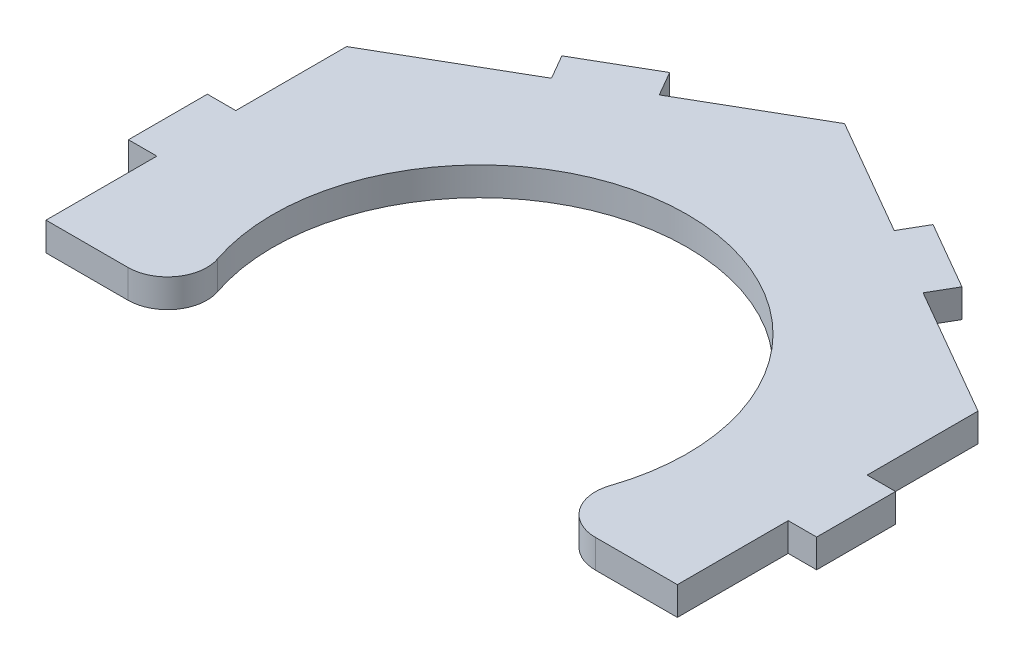
ISO-10303-21;
HEADER;
FILE_DESCRIPTION(('STEP AP214'),'2;1');
FILE_NAME('part.step','',(''),(''),'','','');
FILE_SCHEMA(('AUTOMOTIVE_DESIGN { 1 0 10303 214 1 1 1 1 }'));
ENDSEC;
DATA;
#1=APPLICATION_CONTEXT('core data for automotive mechanical design processes');
#2=APPLICATION_PROTOCOL_DEFINITION('international standard','automotive_design',2000,#1);
#3=PRODUCT_CONTEXT('',#1,'mechanical');
#4=PRODUCT('Part','Part','',(#3));
#5=PRODUCT_RELATED_PRODUCT_CATEGORY('part','',(#4));
#6=PRODUCT_DEFINITION_FORMATION('','',#4);
#7=PRODUCT_DEFINITION_CONTEXT('part definition',#1,'design');
#8=PRODUCT_DEFINITION('design','',#6,#7);
#9=PRODUCT_DEFINITION_SHAPE('','',#8);
#10=(LENGTH_UNIT() NAMED_UNIT(*) SI_UNIT(.MILLI.,.METRE.));
#11=(NAMED_UNIT(*) PLANE_ANGLE_UNIT() SI_UNIT($,.RADIAN.));
#12=(NAMED_UNIT(*) SI_UNIT($,.STERADIAN.) SOLID_ANGLE_UNIT());
#13=UNCERTAINTY_MEASURE_WITH_UNIT(LENGTH_MEASURE(1.E-05),#10,'distance_accuracy_value','');
#14=(GEOMETRIC_REPRESENTATION_CONTEXT(3) GLOBAL_UNCERTAINTY_ASSIGNED_CONTEXT((#13)) GLOBAL_UNIT_ASSIGNED_CONTEXT((#10,
#11,#12)) REPRESENTATION_CONTEXT('',''));
#15=CARTESIAN_POINT('',(0.,0.,0.));
#16=DIRECTION('',(0.,0.,1.));
#17=DIRECTION('',(1.,0.,0.));
#18=AXIS2_PLACEMENT_3D('',#15,#16,#17);
#19=CARTESIAN_POINT('',(50.8,4.572,19.05));
#20=DIRECTION('',(-1.,0.,0.));
#21=DIRECTION('',(0.,0.,1.));
#22=AXIS2_PLACEMENT_3D('',#19,#20,#21);
#23=PLANE('',#22);
#24=DIRECTION('',(0.,1.,0.));
#25=VECTOR('',#24,1.);
#26=CARTESIAN_POINT('',(50.8,0.,-11.4896968374165));
#27=LINE('',#26,#25);
#28=CARTESIAN_POINT('',(50.8,0.,-11.4896968374165));
#29=VERTEX_POINT('',#28);
#30=CARTESIAN_POINT('',(50.8,4.572,-11.4896968374165));
#31=VERTEX_POINT('',#30);
#32=EDGE_CURVE('E214',#29,#31,#27,.T.);
#33=ORIENTED_EDGE('',*,*,#32,.F.);
#34=DIRECTION('',(0.,0.,-1.));
#35=VECTOR('',#34,1.);
#36=CARTESIAN_POINT('',(50.8,0.,19.05));
#37=LINE('',#36,#35);
#38=CARTESIAN_POINT('',(50.8,0.,-29.329393674833));
#39=VERTEX_POINT('',#38);
#40=EDGE_CURVE('E281',#29,#39,#37,.T.);
#41=ORIENTED_EDGE('',*,*,#40,.T.);
#42=DIRECTION('',(0.,-1.,0.));
#43=VECTOR('',#42,1.);
#44=CARTESIAN_POINT('',(50.8,4.572,-29.329393674833));
#45=LINE('',#44,#43);
#46=CARTESIAN_POINT('',(50.8,4.572,-29.329393674833));
#47=VERTEX_POINT('',#46);
#48=EDGE_CURVE('E54',#47,#39,#45,.T.);
#49=ORIENTED_EDGE('',*,*,#48,.F.);
#50=DIRECTION('',(0.,0.,-1.));
#51=VECTOR('',#50,1.);
#52=CARTESIAN_POINT('',(50.8,4.572,19.05));
#53=LINE('',#52,#51);
#54=EDGE_CURVE('E231',#31,#47,#53,.T.);
#55=ORIENTED_EDGE('',*,*,#54,.F.);
#56=EDGE_LOOP('',(#33,#41,#49,#55));
#57=FACE_BOUND('',#56,.T.);
#58=ADVANCED_FACE('F45',(#57),#23,.F.);
#59=CARTESIAN_POINT('',(50.8,4.572,-29.329393674833));
#60=DIRECTION('',(-0.5,0.,0.866025403784439));
#61=DIRECTION('',(0.866025403784439,0.,0.5));
#62=AXIS2_PLACEMENT_3D('',#59,#60,#61);
#63=PLANE('',#62);
#64=DIRECTION('',(-0.866025403784439,0.,-0.5));
#65=VECTOR('',#64,1.);
#66=CARTESIAN_POINT('',(50.8,4.572,-29.329393674833));
#67=LINE('',#66,#65);
#68=CARTESIAN_POINT('',(18.9042843786191,4.572,-47.744393674833));
#69=VERTEX_POINT('',#68);
#70=CARTESIAN_POINT('',(0.,4.572,-58.658787349666));
#71=VERTEX_POINT('',#70);
#72=EDGE_CURVE('E69',#69,#71,#67,.T.);
#73=ORIENTED_EDGE('',*,*,#72,.F.);
#74=DIRECTION('',(0.,1.,0.));
#75=VECTOR('',#74,1.);
#76=CARTESIAN_POINT('',(18.9042843786191,0.,-47.744393674833));
#77=LINE('',#76,#75);
#78=CARTESIAN_POINT('',(18.9042843786191,0.,-47.744393674833));
#79=VERTEX_POINT('',#78);
#80=EDGE_CURVE('E472',#79,#69,#77,.T.);
#81=ORIENTED_EDGE('',*,*,#80,.F.);
#82=DIRECTION('',(-0.866025403784439,0.,-0.5));
#83=VECTOR('',#82,1.);
#84=CARTESIAN_POINT('',(50.8,0.,-29.329393674833));
#85=LINE('',#84,#83);
#86=CARTESIAN_POINT('',(0.,0.,-58.658787349666));
#87=VERTEX_POINT('',#86);
#88=EDGE_CURVE('E287',#79,#87,#85,.T.);
#89=ORIENTED_EDGE('',*,*,#88,.T.);
#90=DIRECTION('',(0.,-1.,0.));
#91=VECTOR('',#90,1.);
#92=CARTESIAN_POINT('',(0.,4.572,-58.658787349666));
#93=LINE('',#92,#91);
#94=EDGE_CURVE('E334',#71,#87,#93,.T.);
#95=ORIENTED_EDGE('',*,*,#94,.F.);
#96=EDGE_LOOP('',(#73,#81,#89,#95));
#97=FACE_BOUND('',#96,.T.);
#98=ADVANCED_FACE('F470',(#97),#63,.F.);
#99=CARTESIAN_POINT('',(0.,4.572,-58.658787349666));
#100=DIRECTION('',(0.5,0.,0.866025403784439));
#101=DIRECTION('',(0.866025403784439,0.,-0.5));
#102=AXIS2_PLACEMENT_3D('',#99,#100,#101);
#103=PLANE('',#102);
#104=DIRECTION('',(-0.866025403784439,0.,0.5));
#105=VECTOR('',#104,1.);
#106=CARTESIAN_POINT('',(0.,4.572,-58.658787349666));
#107=LINE('',#106,#105);
#108=CARTESIAN_POINT('',(-29.9028070066815,4.572,-41.394393674833));
#109=VERTEX_POINT('',#108);
#110=CARTESIAN_POINT('',(-50.8,4.572,-29.329393674833));
#111=VERTEX_POINT('',#110);
#112=EDGE_CURVE('E254',#109,#111,#107,.T.);
#113=ORIENTED_EDGE('',*,*,#112,.F.);
#114=DIRECTION('',(0.,1.,0.));
#115=VECTOR('',#114,1.);
#116=CARTESIAN_POINT('',(-29.9028070066815,0.,-41.394393674833));
#117=LINE('',#116,#115);
#118=CARTESIAN_POINT('',(-29.9028070066815,0.,-41.394393674833));
#119=VERTEX_POINT('',#118);
#120=EDGE_CURVE('E375',#119,#109,#117,.T.);
#121=ORIENTED_EDGE('',*,*,#120,.F.);
#122=DIRECTION('',(-0.866025403784439,0.,0.5));
#123=VECTOR('',#122,1.);
#124=CARTESIAN_POINT('',(0.,0.,-58.658787349666));
#125=LINE('',#124,#123);
#126=CARTESIAN_POINT('',(-50.8,0.,-29.329393674833));
#127=VERTEX_POINT('',#126);
#128=EDGE_CURVE('E291',#119,#127,#125,.T.);
#129=ORIENTED_EDGE('',*,*,#128,.T.);
#130=DIRECTION('',(0.,-1.,0.));
#131=VECTOR('',#130,1.);
#132=CARTESIAN_POINT('',(-50.8,4.572,-29.329393674833));
#133=LINE('',#132,#131);
#134=EDGE_CURVE('E330',#111,#127,#133,.T.);
#135=ORIENTED_EDGE('',*,*,#134,.F.);
#136=EDGE_LOOP('',(#113,#121,#129,#135));
#137=FACE_BOUND('',#136,.T.);
#138=ADVANCED_FACE('F447',(#137),#103,.F.);
#139=CARTESIAN_POINT('',(-50.8,4.572,-29.329393674833));
#140=DIRECTION('',(1.,0.,0.));
#141=DIRECTION('',(0.,0.,-1.));
#142=AXIS2_PLACEMENT_3D('',#139,#140,#141);
#143=PLANE('',#142);
#144=DIRECTION('',(0.,1.,0.));
#145=VECTOR('',#144,1.);
#146=CARTESIAN_POINT('',(-50.8,0.,1.21030316258351));
#147=LINE('',#146,#145);
#148=CARTESIAN_POINT('',(-50.8,0.,1.21030316258351));
#149=VERTEX_POINT('',#148);
#150=CARTESIAN_POINT('',(-50.8,4.572,1.21030316258351));
#151=VERTEX_POINT('',#150);
#152=EDGE_CURVE('E282',#149,#151,#147,.T.);
#153=ORIENTED_EDGE('',*,*,#152,.F.);
#154=DIRECTION('',(0.,0.,1.));
#155=VECTOR('',#154,1.);
#156=CARTESIAN_POINT('',(-50.8,0.,-29.329393674833));
#157=LINE('',#156,#155);
#158=CARTESIAN_POINT('',(-50.8,0.,19.05));
#159=VERTEX_POINT('',#158);
#160=EDGE_CURVE('E295',#149,#159,#157,.T.);
#161=ORIENTED_EDGE('',*,*,#160,.T.);
#162=DIRECTION('',(0.,-1.,0.));
#163=VECTOR('',#162,1.);
#164=CARTESIAN_POINT('',(-50.8,4.572,19.05));
#165=LINE('',#164,#163);
#166=CARTESIAN_POINT('',(-50.8,4.572,19.05));
#167=VERTEX_POINT('',#166);
#168=EDGE_CURVE('E326',#167,#159,#165,.T.);
#169=ORIENTED_EDGE('',*,*,#168,.F.);
#170=DIRECTION('',(0.,0.,1.));
#171=VECTOR('',#170,1.);
#172=CARTESIAN_POINT('',(-50.8,4.572,-29.329393674833));
#173=LINE('',#172,#171);
#174=EDGE_CURVE('E259',#151,#167,#173,.T.);
#175=ORIENTED_EDGE('',*,*,#174,.F.);
#176=EDGE_LOOP('',(#153,#161,#169,#175));
#177=FACE_BOUND('',#176,.T.);
#178=ADVANCED_FACE('F462',(#177),#143,.F.);
#179=CARTESIAN_POINT('',(50.8,4.572,19.05));
#180=DIRECTION('',(0.,0.,-1.));
#181=DIRECTION('',(-1.,0.,0.));
#182=AXIS2_PLACEMENT_3D('',#179,#180,#181);
#183=PLANE('',#182);
#184=DIRECTION('',(1.,0.,0.));
#185=VECTOR('',#184,1.);
#186=CARTESIAN_POINT('',(50.8,0.,19.05));
#187=LINE('',#186,#185);
#188=CARTESIAN_POINT('',(37.6006337213883,0.,19.05));
#189=VERTEX_POINT('',#188);
#190=CARTESIAN_POINT('',(50.8,0.,19.05));
#191=VERTEX_POINT('',#190);
#192=EDGE_CURVE('E277',#189,#191,#187,.T.);
#193=ORIENTED_EDGE('',*,*,#192,.T.);
#194=DIRECTION('',(0.,-1.,0.));
#195=VECTOR('',#194,1.);
#196=CARTESIAN_POINT('',(50.8,4.572,19.05));
#197=LINE('',#196,#195);
#198=CARTESIAN_POINT('',(50.8,4.572,19.05));
#199=VERTEX_POINT('',#198);
#200=EDGE_CURVE('E11',#199,#191,#197,.T.);
#201=ORIENTED_EDGE('',*,*,#200,.F.);
#202=DIRECTION('',(1.,0.,0.));
#203=VECTOR('',#202,1.);
#204=CARTESIAN_POINT('',(50.8,4.572,19.05));
#205=LINE('',#204,#203);
#206=CARTESIAN_POINT('',(37.6006337213883,4.572,19.05));
#207=VERTEX_POINT('',#206);
#208=EDGE_CURVE('E242',#207,#199,#205,.T.);
#209=ORIENTED_EDGE('',*,*,#208,.F.);
#210=DIRECTION('',(0.,-1.,0.));
#211=VECTOR('',#210,1.);
#212=CARTESIAN_POINT('',(37.6006337213883,4.572,19.05));
#213=LINE('',#212,#211);
#214=EDGE_CURVE('E276',#207,#189,#213,.T.);
#215=ORIENTED_EDGE('',*,*,#214,.T.);
#216=EDGE_LOOP('',(#193,#201,#209,#215));
#217=FACE_BOUND('',#216,.T.);
#218=ADVANCED_FACE('F47',(#217),#183,.F.);
#219=CARTESIAN_POINT('',(50.8,0.,1.21030316258351));
#220=VERTEX_POINT('',#219);
#221=EDGE_CURVE('E283',#191,#220,#37,.T.);
#222=ORIENTED_EDGE('',*,*,#221,.T.);
#223=DIRECTION('',(0.,1.,0.));
#224=VECTOR('',#223,1.);
#225=CARTESIAN_POINT('',(50.8,0.,1.21030316258351));
#226=LINE('',#225,#224);
#227=CARTESIAN_POINT('',(50.8,4.572,1.21030316258351));
#228=VERTEX_POINT('',#227);
#229=EDGE_CURVE('E511',#220,#228,#226,.T.);
#230=ORIENTED_EDGE('',*,*,#229,.T.);
#231=EDGE_CURVE('E241',#199,#228,#53,.T.);
#232=ORIENTED_EDGE('',*,*,#231,.F.);
#233=ORIENTED_EDGE('',*,*,#200,.T.);
#234=EDGE_LOOP('',(#222,#230,#232,#233));
#235=FACE_BOUND('',#234,.T.);
#236=ADVANCED_FACE('F510',(#235),#23,.F.);
#237=CARTESIAN_POINT('',(29.9028070066815,0.,-41.394393674833));
#238=VERTEX_POINT('',#237);
#239=EDGE_CURVE('E288',#39,#238,#85,.T.);
#240=ORIENTED_EDGE('',*,*,#239,.T.);
#241=DIRECTION('',(0.,1.,0.));
#242=VECTOR('',#241,1.);
#243=CARTESIAN_POINT('',(29.9028070066815,0.,-41.394393674833));
#244=LINE('',#243,#242);
#245=CARTESIAN_POINT('',(29.9028070066815,4.572,-41.394393674833));
#246=VERTEX_POINT('',#245);
#247=EDGE_CURVE('E534',#238,#246,#244,.T.);
#248=ORIENTED_EDGE('',*,*,#247,.T.);
#249=EDGE_CURVE('E251',#47,#246,#67,.T.);
#250=ORIENTED_EDGE('',*,*,#249,.F.);
#251=ORIENTED_EDGE('',*,*,#48,.T.);
#252=EDGE_LOOP('',(#240,#248,#250,#251));
#253=FACE_BOUND('',#252,.T.);
#254=ADVANCED_FACE('F340',(#253),#63,.F.);
#255=CARTESIAN_POINT('',(-18.9042843786191,0.,-47.744393674833));
#256=VERTEX_POINT('',#255);
#257=EDGE_CURVE('E292',#87,#256,#125,.T.);
#258=ORIENTED_EDGE('',*,*,#257,.T.);
#259=DIRECTION('',(0.,1.,0.));
#260=VECTOR('',#259,1.);
#261=CARTESIAN_POINT('',(-18.9042843786191,0.,-47.744393674833));
#262=LINE('',#261,#260);
#263=CARTESIAN_POINT('',(-18.9042843786191,4.572,-47.744393674833));
#264=VERTEX_POINT('',#263);
#265=EDGE_CURVE('E365',#256,#264,#262,.T.);
#266=ORIENTED_EDGE('',*,*,#265,.T.);
#267=EDGE_CURVE('E255',#71,#264,#107,.T.);
#268=ORIENTED_EDGE('',*,*,#267,.F.);
#269=ORIENTED_EDGE('',*,*,#94,.T.);
#270=EDGE_LOOP('',(#258,#266,#268,#269));
#271=FACE_BOUND('',#270,.T.);
#272=ADVANCED_FACE('F476',(#271),#103,.F.);
#273=CARTESIAN_POINT('',(-50.8,0.,-11.4896968374165));
#274=VERTEX_POINT('',#273);
#275=EDGE_CURVE('E296',#127,#274,#157,.T.);
#276=ORIENTED_EDGE('',*,*,#275,.T.);
#277=DIRECTION('',(0.,1.,0.));
#278=VECTOR('',#277,1.);
#279=CARTESIAN_POINT('',(-50.8,0.,-11.4896968374165));
#280=LINE('',#279,#278);
#281=CARTESIAN_POINT('',(-50.8,4.572,-11.4896968374165));
#282=VERTEX_POINT('',#281);
#283=EDGE_CURVE('E416',#274,#282,#280,.T.);
#284=ORIENTED_EDGE('',*,*,#283,.T.);
#285=EDGE_CURVE('E260',#111,#282,#173,.T.);
#286=ORIENTED_EDGE('',*,*,#285,.F.);
#287=ORIENTED_EDGE('',*,*,#134,.T.);
#288=EDGE_LOOP('',(#276,#284,#286,#287));
#289=FACE_BOUND('',#288,.T.);
#290=ADVANCED_FACE('F438',(#289),#143,.F.);
#291=CARTESIAN_POINT('',(-50.8,4.572,19.05));
#292=DIRECTION('',(0.,0.,-1.));
#293=DIRECTION('',(-1.,0.,0.));
#294=AXIS2_PLACEMENT_3D('',#291,#292,#293);
#295=PLANE('',#294);
#296=DIRECTION('',(1.,0.,0.));
#297=VECTOR('',#296,1.);
#298=CARTESIAN_POINT('',(-50.8,0.,19.05));
#299=LINE('',#298,#297);
#300=CARTESIAN_POINT('',(-37.6006337213883,0.,19.05));
#301=VERTEX_POINT('',#300);
#302=EDGE_CURVE('E300',#159,#301,#299,.T.);
#303=ORIENTED_EDGE('',*,*,#302,.T.);
#304=DIRECTION('',(0.,-1.,0.));
#305=VECTOR('',#304,1.);
#306=CARTESIAN_POINT('',(-37.6006337213883,4.572,19.05));
#307=LINE('',#306,#305);
#308=CARTESIAN_POINT('',(-37.6006337213883,4.572,19.05));
#309=VERTEX_POINT('',#308);
#310=EDGE_CURVE('E322',#309,#301,#307,.T.);
#311=ORIENTED_EDGE('',*,*,#310,.F.);
#312=DIRECTION('',(1.,0.,0.));
#313=VECTOR('',#312,1.);
#314=CARTESIAN_POINT('',(-50.8,4.572,19.05));
#315=LINE('',#314,#313);
#316=EDGE_CURVE('E264',#167,#309,#315,.T.);
#317=ORIENTED_EDGE('',*,*,#316,.F.);
#318=ORIENTED_EDGE('',*,*,#168,.T.);
#319=EDGE_LOOP('',(#303,#311,#317,#318));
#320=FACE_BOUND('',#319,.T.);
#321=ADVANCED_FACE('F491',(#320),#295,.F.);
#322=CARTESIAN_POINT('',(-37.6006337213883,4.572,12.7));
#323=DIRECTION('',(0.,-1.,0.));
#324=DIRECTION('',(0.,0.,-1.));
#325=AXIS2_PLACEMENT_3D('',#322,#323,#324);
#326=CYLINDRICAL_SURFACE('',#325,6.34999999999999);
#327=CARTESIAN_POINT('',(-37.6006337213883,0.,12.7));
#328=DIRECTION('',(0.,1.,0.));
#329=DIRECTION('',(0.,0.,1.));
#330=AXIS2_PLACEMENT_3D('',#327,#328,#329);
#331=CIRCLE('',#330,6.34999999999999);
#332=CARTESIAN_POINT('',(-31.5845323259661,0.,10.668));
#333=VERTEX_POINT('',#332);
#334=EDGE_CURVE('E303',#301,#333,#331,.T.);
#335=ORIENTED_EDGE('',*,*,#334,.T.);
#336=DIRECTION('',(0.,-1.,0.));
#337=VECTOR('',#336,1.);
#338=CARTESIAN_POINT('',(-31.5845323259661,4.572,10.668));
#339=LINE('',#338,#337);
#340=CARTESIAN_POINT('',(-31.5845323259661,4.572,10.668));
#341=VERTEX_POINT('',#340);
#342=EDGE_CURVE('E318',#341,#333,#339,.T.);
#343=ORIENTED_EDGE('',*,*,#342,.F.);
#344=CARTESIAN_POINT('',(-37.6006337213883,4.572,12.7));
#345=DIRECTION('',(0.,1.,0.));
#346=DIRECTION('',(0.,0.,1.));
#347=AXIS2_PLACEMENT_3D('',#344,#345,#346);
#348=CIRCLE('',#347,6.34999999999999);
#349=EDGE_CURVE('E267',#309,#341,#348,.T.);
#350=ORIENTED_EDGE('',*,*,#349,.F.);
#351=ORIENTED_EDGE('',*,*,#310,.T.);
#352=EDGE_LOOP('',(#335,#343,#350,#351));
#353=FACE_BOUND('',#352,.T.);
#354=ADVANCED_FACE('F495',(#353),#326,.T.);
#355=CARTESIAN_POINT('',(0.,4.572,0.));
#356=DIRECTION('',(0.,-1.,0.));
#357=DIRECTION('',(0.,0.,-1.));
#358=AXIS2_PLACEMENT_3D('',#355,#356,#357);
#359=CYLINDRICAL_SURFACE('',#358,33.3375);
#360=CARTESIAN_POINT('',(0.,0.,0.));
#361=DIRECTION('',(0.,-1.,0.));
#362=DIRECTION('',(0.,0.,1.));
#363=AXIS2_PLACEMENT_3D('',#360,#361,#362);
#364=CIRCLE('',#363,33.3375);
#365=CARTESIAN_POINT('',(31.5845323259661,0.,10.668));
#366=VERTEX_POINT('',#365);
#367=EDGE_CURVE('E306',#333,#366,#364,.T.);
#368=ORIENTED_EDGE('',*,*,#367,.T.);
#369=DIRECTION('',(0.,-1.,0.));
#370=VECTOR('',#369,1.);
#371=CARTESIAN_POINT('',(31.5845323259661,4.572,10.668));
#372=LINE('',#371,#370);
#373=CARTESIAN_POINT('',(31.5845323259661,4.572,10.668));
#374=VERTEX_POINT('',#373);
#375=EDGE_CURVE('E314',#374,#366,#372,.T.);
#376=ORIENTED_EDGE('',*,*,#375,.F.);
#377=CARTESIAN_POINT('',(0.,4.572,0.));
#378=DIRECTION('',(0.,-1.,0.));
#379=DIRECTION('',(0.,0.,1.));
#380=AXIS2_PLACEMENT_3D('',#377,#378,#379);
#381=CIRCLE('',#380,33.3375);
#382=EDGE_CURVE('E270',#341,#374,#381,.T.);
#383=ORIENTED_EDGE('',*,*,#382,.F.);
#384=ORIENTED_EDGE('',*,*,#342,.T.);
#385=EDGE_LOOP('',(#368,#376,#383,#384));
#386=FACE_BOUND('',#385,.T.);
#387=ADVANCED_FACE('F501',(#386),#359,.F.);
#388=CARTESIAN_POINT('',(37.6006337213883,4.572,12.7));
#389=DIRECTION('',(0.,-1.,0.));
#390=DIRECTION('',(0.,0.,-1.));
#391=AXIS2_PLACEMENT_3D('',#388,#389,#390);
#392=CYLINDRICAL_SURFACE('',#391,6.35);
#393=CARTESIAN_POINT('',(37.6006337213883,0.,12.7));
#394=DIRECTION('',(0.,1.,0.));
#395=DIRECTION('',(0.,0.,-1.));
#396=AXIS2_PLACEMENT_3D('',#393,#394,#395);
#397=CIRCLE('',#396,6.35);
#398=EDGE_CURVE('E247',#366,#189,#397,.T.);
#399=ORIENTED_EDGE('',*,*,#398,.T.);
#400=ORIENTED_EDGE('',*,*,#214,.F.);
#401=CARTESIAN_POINT('',(37.6006337213883,4.572,12.7));
#402=DIRECTION('',(0.,1.,0.));
#403=DIRECTION('',(0.,0.,-1.));
#404=AXIS2_PLACEMENT_3D('',#401,#402,#403);
#405=CIRCLE('',#404,6.35);
#406=EDGE_CURVE('E273',#374,#207,#405,.T.);
#407=ORIENTED_EDGE('',*,*,#406,.F.);
#408=ORIENTED_EDGE('',*,*,#375,.T.);
#409=EDGE_LOOP('',(#399,#400,#407,#408));
#410=FACE_BOUND('',#409,.T.);
#411=ADVANCED_FACE('F505',(#410),#392,.T.);
#412=CARTESIAN_POINT('',(37.6006337213883,4.572,12.7));
#413=DIRECTION('',(0.,-1.,0.));
#414=DIRECTION('',(0.,0.,-1.));
#415=AXIS2_PLACEMENT_3D('',#412,#413,#414);
#416=PLANE('',#415);
#417=ORIENTED_EDGE('',*,*,#208,.T.);
#418=ORIENTED_EDGE('',*,*,#231,.T.);
#419=DIRECTION('',(1.,0.,0.));
#420=VECTOR('',#419,1.);
#421=CARTESIAN_POINT('',(55.372,4.572,1.21030316258351));
#422=LINE('',#421,#420);
#423=CARTESIAN_POINT('',(55.372,4.572,1.21030316258351));
#424=VERTEX_POINT('',#423);
#425=EDGE_CURVE('E61',#228,#424,#422,.T.);
#426=ORIENTED_EDGE('',*,*,#425,.T.);
#427=DIRECTION('',(0.,0.,-1.));
#428=VECTOR('',#427,1.);
#429=CARTESIAN_POINT('',(55.372,4.572,-11.4896968374165));
#430=LINE('',#429,#428);
#431=CARTESIAN_POINT('',(55.372,4.572,-11.4896968374165));
#432=VERTEX_POINT('',#431);
#433=EDGE_CURVE('E234',#424,#432,#430,.T.);
#434=ORIENTED_EDGE('',*,*,#433,.T.);
#435=DIRECTION('',(-1.,0.,0.));
#436=VECTOR('',#435,1.);
#437=CARTESIAN_POINT('',(50.8,4.572,-11.4896968374165));
#438=LINE('',#437,#436);
#439=EDGE_CURVE('E217',#432,#31,#438,.T.);
#440=ORIENTED_EDGE('',*,*,#439,.T.);
#441=ORIENTED_EDGE('',*,*,#54,.T.);
#442=ORIENTED_EDGE('',*,*,#249,.T.);
#443=DIRECTION('',(0.500000000000002,0.,-0.866025403784438));
#444=VECTOR('',#443,1.);
#445=CARTESIAN_POINT('',(32.1888070066815,4.572,-45.3538618209354));
#446=LINE('',#445,#444);
#447=CARTESIAN_POINT('',(32.1888070066815,4.572,-45.3538618209354));
#448=VERTEX_POINT('',#447);
#449=EDGE_CURVE('E379',#246,#448,#446,.T.);
#450=ORIENTED_EDGE('',*,*,#449,.T.);
#451=DIRECTION('',(-0.866025403784438,0.,-0.5));
#452=VECTOR('',#451,1.);
#453=CARTESIAN_POINT('',(21.1902843786191,4.572,-51.7038618209354));
#454=LINE('',#453,#452);
#455=CARTESIAN_POINT('',(21.1902843786191,4.572,-51.7038618209354));
#456=VERTEX_POINT('',#455);
#457=EDGE_CURVE('E359',#448,#456,#454,.T.);
#458=ORIENTED_EDGE('',*,*,#457,.T.);
#459=DIRECTION('',(-0.5,0.,0.866025403784438));
#460=VECTOR('',#459,1.);
#461=CARTESIAN_POINT('',(18.9042843786191,4.572,-47.744393674833));
#462=LINE('',#461,#460);
#463=EDGE_CURVE('E354',#456,#69,#462,.T.);
#464=ORIENTED_EDGE('',*,*,#463,.T.);
#465=ORIENTED_EDGE('',*,*,#72,.T.);
#466=ORIENTED_EDGE('',*,*,#267,.T.);
#467=DIRECTION('',(-0.5,0.,-0.866025403784438));
#468=VECTOR('',#467,1.);
#469=CARTESIAN_POINT('',(-21.1902843786191,4.572,-51.7038618209354));
#470=LINE('',#469,#468);
#471=CARTESIAN_POINT('',(-21.1902843786191,4.572,-51.7038618209354));
#472=VERTEX_POINT('',#471);
#473=EDGE_CURVE('E389',#264,#472,#470,.T.);
#474=ORIENTED_EDGE('',*,*,#473,.T.);
#475=DIRECTION('',(-0.866025403784439,0.,0.5));
#476=VECTOR('',#475,1.);
#477=CARTESIAN_POINT('',(-32.1888070066815,4.572,-45.3538618209354));
#478=LINE('',#477,#476);
#479=CARTESIAN_POINT('',(-32.1888070066815,4.572,-45.3538618209354));
#480=VERTEX_POINT('',#479);
#481=EDGE_CURVE('E384',#472,#480,#478,.T.);
#482=ORIENTED_EDGE('',*,*,#481,.T.);
#483=DIRECTION('',(0.5,0.,0.866025403784438));
#484=VECTOR('',#483,1.);
#485=CARTESIAN_POINT('',(-29.9028070066815,4.572,-41.394393674833));
#486=LINE('',#485,#484);
#487=EDGE_CURVE('E380',#480,#109,#486,.T.);
#488=ORIENTED_EDGE('',*,*,#487,.T.);
#489=ORIENTED_EDGE('',*,*,#112,.T.);
#490=ORIENTED_EDGE('',*,*,#285,.T.);
#491=DIRECTION('',(-1.,0.,0.));
#492=VECTOR('',#491,1.);
#493=CARTESIAN_POINT('',(-50.8,4.572,-11.4896968374165));
#494=LINE('',#493,#492);
#495=CARTESIAN_POINT('',(-55.372,4.572,-11.4896968374165));
#496=VERTEX_POINT('',#495);
#497=EDGE_CURVE('E393',#282,#496,#494,.T.);
#498=ORIENTED_EDGE('',*,*,#497,.T.);
#499=DIRECTION('',(0.,0.,1.));
#500=VECTOR('',#499,1.);
#501=CARTESIAN_POINT('',(-55.372,4.572,-11.4896968374165));
#502=LINE('',#501,#500);
#503=CARTESIAN_POINT('',(-55.372,4.572,1.21030316258352));
#504=VERTEX_POINT('',#503);
#505=EDGE_CURVE('E420',#496,#504,#502,.T.);
#506=ORIENTED_EDGE('',*,*,#505,.T.);
#507=DIRECTION('',(1.,0.,0.));
#508=VECTOR('',#507,1.);
#509=CARTESIAN_POINT('',(-55.372,4.572,1.21030316258352));
#510=LINE('',#509,#508);
#511=EDGE_CURVE('E409',#504,#151,#510,.T.);
#512=ORIENTED_EDGE('',*,*,#511,.T.);
#513=ORIENTED_EDGE('',*,*,#174,.T.);
#514=ORIENTED_EDGE('',*,*,#316,.T.);
#515=ORIENTED_EDGE('',*,*,#349,.T.);
#516=ORIENTED_EDGE('',*,*,#382,.T.);
#517=ORIENTED_EDGE('',*,*,#406,.T.);
#518=EDGE_LOOP('',(#417,#418,#426,#434,#440,#441,#442,#450,#458,#464,#465,#466,#474,#482,#488,
#489,#490,#498,#506,#512,#513,#514,#515,#516,#517));
#519=FACE_BOUND('',#518,.T.);
#520=ADVANCED_FACE('F229',(#519),#416,.F.);
#521=CARTESIAN_POINT('',(37.6006337213883,0.,12.7));
#522=DIRECTION('',(0.,-1.,0.));
#523=DIRECTION('',(0.,0.,-1.));
#524=AXIS2_PLACEMENT_3D('',#521,#522,#523);
#525=PLANE('',#524);
#526=ORIENTED_EDGE('',*,*,#192,.F.);
#527=ORIENTED_EDGE('',*,*,#398,.F.);
#528=ORIENTED_EDGE('',*,*,#367,.F.);
#529=ORIENTED_EDGE('',*,*,#334,.F.);
#530=ORIENTED_EDGE('',*,*,#302,.F.);
#531=ORIENTED_EDGE('',*,*,#160,.F.);
#532=DIRECTION('',(1.,0.,0.));
#533=VECTOR('',#532,1.);
#534=CARTESIAN_POINT('',(-55.372,0.,1.21030316258352));
#535=LINE('',#534,#533);
#536=CARTESIAN_POINT('',(-55.372,0.,1.21030316258352));
#537=VERTEX_POINT('',#536);
#538=EDGE_CURVE('E413',#537,#149,#535,.T.);
#539=ORIENTED_EDGE('',*,*,#538,.F.);
#540=DIRECTION('',(0.,0.,1.));
#541=VECTOR('',#540,1.);
#542=CARTESIAN_POINT('',(-55.372,0.,-11.4896968374165));
#543=LINE('',#542,#541);
#544=CARTESIAN_POINT('',(-55.372,0.,-11.4896968374165));
#545=VERTEX_POINT('',#544);
#546=EDGE_CURVE('E408',#545,#537,#543,.T.);
#547=ORIENTED_EDGE('',*,*,#546,.F.);
#548=DIRECTION('',(-1.,0.,0.));
#549=VECTOR('',#548,1.);
#550=CARTESIAN_POINT('',(-50.8,0.,-11.4896968374165));
#551=LINE('',#550,#549);
#552=EDGE_CURVE('E404',#274,#545,#551,.T.);
#553=ORIENTED_EDGE('',*,*,#552,.F.);
#554=ORIENTED_EDGE('',*,*,#275,.F.);
#555=ORIENTED_EDGE('',*,*,#128,.F.);
#556=DIRECTION('',(0.5,0.,0.866025403784438));
#557=VECTOR('',#556,1.);
#558=CARTESIAN_POINT('',(-29.9028070066815,0.,-41.394393674833));
#559=LINE('',#558,#557);
#560=CARTESIAN_POINT('',(-32.1888070066815,0.,-45.3538618209354));
#561=VERTEX_POINT('',#560);
#562=EDGE_CURVE('E368',#561,#119,#559,.T.);
#563=ORIENTED_EDGE('',*,*,#562,.F.);
#564=DIRECTION('',(-0.866025403784439,0.,0.5));
#565=VECTOR('',#564,1.);
#566=CARTESIAN_POINT('',(-32.1888070066815,0.,-45.3538618209354));
#567=LINE('',#566,#565);
#568=CARTESIAN_POINT('',(-21.1902843786191,0.,-51.7038618209354));
#569=VERTEX_POINT('',#568);
#570=EDGE_CURVE('E397',#569,#561,#567,.T.);
#571=ORIENTED_EDGE('',*,*,#570,.F.);
#572=DIRECTION('',(-0.5,0.,-0.866025403784438));
#573=VECTOR('',#572,1.);
#574=CARTESIAN_POINT('',(-21.1902843786191,0.,-51.7038618209354));
#575=LINE('',#574,#573);
#576=EDGE_CURVE('E385',#256,#569,#575,.T.);
#577=ORIENTED_EDGE('',*,*,#576,.F.);
#578=ORIENTED_EDGE('',*,*,#257,.F.);
#579=ORIENTED_EDGE('',*,*,#88,.F.);
#580=DIRECTION('',(-0.5,0.,0.866025403784438));
#581=VECTOR('',#580,1.);
#582=CARTESIAN_POINT('',(18.9042843786191,0.,-47.744393674833));
#583=LINE('',#582,#581);
#584=CARTESIAN_POINT('',(21.1902843786191,0.,-51.7038618209354));
#585=VERTEX_POINT('',#584);
#586=EDGE_CURVE('E361',#585,#79,#583,.T.);
#587=ORIENTED_EDGE('',*,*,#586,.F.);
#588=DIRECTION('',(-0.866025403784438,0.,-0.5));
#589=VECTOR('',#588,1.);
#590=CARTESIAN_POINT('',(21.1902843786191,0.,-51.7038618209354));
#591=LINE('',#590,#589);
#592=CARTESIAN_POINT('',(32.1888070066815,0.,-45.3538618209354));
#593=VERTEX_POINT('',#592);
#594=EDGE_CURVE('E351',#593,#585,#591,.T.);
#595=ORIENTED_EDGE('',*,*,#594,.F.);
#596=DIRECTION('',(0.500000000000002,0.,-0.866025403784438));
#597=VECTOR('',#596,1.);
#598=CARTESIAN_POINT('',(32.1888070066815,0.,-45.3538618209354));
#599=LINE('',#598,#597);
#600=EDGE_CURVE('E348',#238,#593,#599,.T.);
#601=ORIENTED_EDGE('',*,*,#600,.F.);
#602=ORIENTED_EDGE('',*,*,#239,.F.);
#603=ORIENTED_EDGE('',*,*,#40,.F.);
#604=DIRECTION('',(-1.,0.,0.));
#605=VECTOR('',#604,1.);
#606=CARTESIAN_POINT('',(50.8,0.,-11.4896968374165));
#607=LINE('',#606,#605);
#608=CARTESIAN_POINT('',(55.372,0.,-11.4896968374165));
#609=VERTEX_POINT('',#608);
#610=EDGE_CURVE('E219',#609,#29,#607,.T.);
#611=ORIENTED_EDGE('',*,*,#610,.F.);
#612=DIRECTION('',(0.,0.,-1.));
#613=VECTOR('',#612,1.);
#614=CARTESIAN_POINT('',(55.372,0.,-11.4896968374165));
#615=LINE('',#614,#613);
#616=CARTESIAN_POINT('',(55.372,0.,1.21030316258351));
#617=VERTEX_POINT('',#616);
#618=EDGE_CURVE('E519',#617,#609,#615,.T.);
#619=ORIENTED_EDGE('',*,*,#618,.F.);
#620=DIRECTION('',(1.,0.,0.));
#621=VECTOR('',#620,1.);
#622=CARTESIAN_POINT('',(55.372,0.,1.21030316258351));
#623=LINE('',#622,#621);
#624=EDGE_CURVE('E236',#220,#617,#623,.T.);
#625=ORIENTED_EDGE('',*,*,#624,.F.);
#626=ORIENTED_EDGE('',*,*,#221,.F.);
#627=EDGE_LOOP('',(#526,#527,#528,#529,#530,#531,#539,#547,#553,#554,#555,#563,#571,#577,#578,
#579,#587,#595,#601,#602,#603,#611,#619,#625,#626));
#628=FACE_BOUND('',#627,.T.);
#629=ADVANCED_FACE('F345',(#628),#525,.T.);
#630=CARTESIAN_POINT('',(-55.372,0.,1.21030316258352));
#631=DIRECTION('',(0.,0.,1.));
#632=DIRECTION('',(1.,0.,0.));
#633=AXIS2_PLACEMENT_3D('',#630,#631,#632);
#634=PLANE('',#633);
#635=ORIENTED_EDGE('',*,*,#511,.F.);
#636=DIRECTION('',(0.,1.,0.));
#637=VECTOR('',#636,1.);
#638=CARTESIAN_POINT('',(-55.372,0.,1.21030316258352));
#639=LINE('',#638,#637);
#640=EDGE_CURVE('E429',#537,#504,#639,.T.);
#641=ORIENTED_EDGE('',*,*,#640,.F.);
#642=ORIENTED_EDGE('',*,*,#538,.T.);
#643=ORIENTED_EDGE('',*,*,#152,.T.);
#644=EDGE_LOOP('',(#635,#641,#642,#643));
#645=FACE_BOUND('',#644,.T.);
#646=ADVANCED_FACE('F458',(#645),#634,.T.);
#647=CARTESIAN_POINT('',(-55.372,0.,-11.4896968374165));
#648=DIRECTION('',(-1.,0.,0.));
#649=DIRECTION('',(0.,0.,1.));
#650=AXIS2_PLACEMENT_3D('',#647,#648,#649);
#651=PLANE('',#650);
#652=ORIENTED_EDGE('',*,*,#505,.F.);
#653=DIRECTION('',(0.,1.,0.));
#654=VECTOR('',#653,1.);
#655=CARTESIAN_POINT('',(-55.372,0.,-11.4896968374165));
#656=LINE('',#655,#654);
#657=EDGE_CURVE('E432',#545,#496,#656,.T.);
#658=ORIENTED_EDGE('',*,*,#657,.F.);
#659=ORIENTED_EDGE('',*,*,#546,.T.);
#660=ORIENTED_EDGE('',*,*,#640,.T.);
#661=EDGE_LOOP('',(#652,#658,#659,#660));
#662=FACE_BOUND('',#661,.T.);
#663=ADVANCED_FACE('F454',(#662),#651,.T.);
#664=CARTESIAN_POINT('',(-50.8,0.,-11.4896968374165));
#665=DIRECTION('',(0.,0.,-1.));
#666=DIRECTION('',(-1.,0.,0.));
#667=AXIS2_PLACEMENT_3D('',#664,#665,#666);
#668=PLANE('',#667);
#669=ORIENTED_EDGE('',*,*,#497,.F.);
#670=ORIENTED_EDGE('',*,*,#283,.F.);
#671=ORIENTED_EDGE('',*,*,#552,.T.);
#672=ORIENTED_EDGE('',*,*,#657,.T.);
#673=EDGE_LOOP('',(#669,#670,#671,#672));
#674=FACE_BOUND('',#673,.T.);
#675=ADVANCED_FACE('F451',(#674),#668,.T.);
#676=CARTESIAN_POINT('',(-29.9028070066815,0.,-41.394393674833));
#677=DIRECTION('',(-0.866025403784438,0.,0.5));
#678=DIRECTION('',(0.5,0.,0.866025403784439));
#679=AXIS2_PLACEMENT_3D('',#676,#677,#678);
#680=PLANE('',#679);
#681=ORIENTED_EDGE('',*,*,#487,.F.);
#682=DIRECTION('',(0.,1.,0.));
#683=VECTOR('',#682,1.);
#684=CARTESIAN_POINT('',(-32.1888070066815,0.,-45.3538618209354));
#685=LINE('',#684,#683);
#686=EDGE_CURVE('E372',#561,#480,#685,.T.);
#687=ORIENTED_EDGE('',*,*,#686,.F.);
#688=ORIENTED_EDGE('',*,*,#562,.T.);
#689=ORIENTED_EDGE('',*,*,#120,.T.);
#690=EDGE_LOOP('',(#681,#687,#688,#689));
#691=FACE_BOUND('',#690,.T.);
#692=ADVANCED_FACE('F696',(#691),#680,.T.);
#693=CARTESIAN_POINT('',(-32.1888070066815,0.,-45.3538618209354));
#694=DIRECTION('',(-0.5,0.,-0.866025403784439));
#695=DIRECTION('',(-0.866025403784439,0.,0.5));
#696=AXIS2_PLACEMENT_3D('',#693,#694,#695);
#697=PLANE('',#696);
#698=ORIENTED_EDGE('',*,*,#481,.F.);
#699=DIRECTION('',(0.,1.,0.));
#700=VECTOR('',#699,1.);
#701=CARTESIAN_POINT('',(-21.1902843786191,0.,-51.7038618209354));
#702=LINE('',#701,#700);
#703=EDGE_CURVE('E369',#569,#472,#702,.T.);
#704=ORIENTED_EDGE('',*,*,#703,.F.);
#705=ORIENTED_EDGE('',*,*,#570,.T.);
#706=ORIENTED_EDGE('',*,*,#686,.T.);
#707=EDGE_LOOP('',(#698,#704,#705,#706));
#708=FACE_BOUND('',#707,.T.);
#709=ADVANCED_FACE('F704',(#708),#697,.T.);
#710=CARTESIAN_POINT('',(-21.1902843786191,0.,-51.7038618209354));
#711=DIRECTION('',(0.866025403784438,0.,-0.5));
#712=DIRECTION('',(-0.5,0.,-0.866025403784439));
#713=AXIS2_PLACEMENT_3D('',#710,#711,#712);
#714=PLANE('',#713);
#715=ORIENTED_EDGE('',*,*,#473,.F.);
#716=ORIENTED_EDGE('',*,*,#265,.F.);
#717=ORIENTED_EDGE('',*,*,#576,.T.);
#718=ORIENTED_EDGE('',*,*,#703,.T.);
#719=EDGE_LOOP('',(#715,#716,#717,#718));
#720=FACE_BOUND('',#719,.T.);
#721=ADVANCED_FACE('F482',(#720),#714,.T.);
#722=CARTESIAN_POINT('',(18.9042843786191,0.,-47.744393674833));
#723=DIRECTION('',(-0.866025403784438,0.,-0.5));
#724=DIRECTION('',(-0.5,0.,0.866025403784439));
#725=AXIS2_PLACEMENT_3D('',#722,#723,#724);
#726=PLANE('',#725);
#727=ORIENTED_EDGE('',*,*,#463,.F.);
#728=DIRECTION('',(0.,1.,0.));
#729=VECTOR('',#728,1.);
#730=CARTESIAN_POINT('',(21.1902843786191,0.,-51.7038618209354));
#731=LINE('',#730,#729);
#732=EDGE_CURVE('E540',#585,#456,#731,.T.);
#733=ORIENTED_EDGE('',*,*,#732,.F.);
#734=ORIENTED_EDGE('',*,*,#586,.T.);
#735=ORIENTED_EDGE('',*,*,#80,.T.);
#736=EDGE_LOOP('',(#727,#733,#734,#735));
#737=FACE_BOUND('',#736,.T.);
#738=ADVANCED_FACE('F551',(#737),#726,.T.);
#739=CARTESIAN_POINT('',(21.1902843786191,0.,-51.7038618209354));
#740=DIRECTION('',(0.5,0.,-0.866025403784438));
#741=DIRECTION('',(-0.866025403784438,0.,-0.5));
#742=AXIS2_PLACEMENT_3D('',#739,#740,#741);
#743=PLANE('',#742);
#744=ORIENTED_EDGE('',*,*,#457,.F.);
#745=DIRECTION('',(0.,1.,0.));
#746=VECTOR('',#745,1.);
#747=CARTESIAN_POINT('',(32.1888070066815,0.,-45.3538618209354));
#748=LINE('',#747,#746);
#749=EDGE_CURVE('E537',#593,#448,#748,.T.);
#750=ORIENTED_EDGE('',*,*,#749,.F.);
#751=ORIENTED_EDGE('',*,*,#594,.T.);
#752=ORIENTED_EDGE('',*,*,#732,.T.);
#753=EDGE_LOOP('',(#744,#750,#751,#752));
#754=FACE_BOUND('',#753,.T.);
#755=ADVANCED_FACE('F554',(#754),#743,.T.);
#756=CARTESIAN_POINT('',(32.1888070066815,0.,-45.3538618209354));
#757=DIRECTION('',(0.866025403784438,0.,0.500000000000001));
#758=DIRECTION('',(0.500000000000001,0.,-0.866025403784438));
#759=AXIS2_PLACEMENT_3D('',#756,#757,#758);
#760=PLANE('',#759);
#761=ORIENTED_EDGE('',*,*,#449,.F.);
#762=ORIENTED_EDGE('',*,*,#247,.F.);
#763=ORIENTED_EDGE('',*,*,#600,.T.);
#764=ORIENTED_EDGE('',*,*,#749,.T.);
#765=EDGE_LOOP('',(#761,#762,#763,#764));
#766=FACE_BOUND('',#765,.T.);
#767=ADVANCED_FACE('F556',(#766),#760,.T.);
#768=CARTESIAN_POINT('',(50.8,0.,-11.4896968374165));
#769=DIRECTION('',(0.,0.,-1.));
#770=DIRECTION('',(-1.,0.,0.));
#771=AXIS2_PLACEMENT_3D('',#768,#769,#770);
#772=PLANE('',#771);
#773=ORIENTED_EDGE('',*,*,#439,.F.);
#774=DIRECTION('',(0.,1.,0.));
#775=VECTOR('',#774,1.);
#776=CARTESIAN_POINT('',(55.372,0.,-11.4896968374165));
#777=LINE('',#776,#775);
#778=EDGE_CURVE('E224',#609,#432,#777,.T.);
#779=ORIENTED_EDGE('',*,*,#778,.F.);
#780=ORIENTED_EDGE('',*,*,#610,.T.);
#781=ORIENTED_EDGE('',*,*,#32,.T.);
#782=EDGE_LOOP('',(#773,#779,#780,#781));
#783=FACE_BOUND('',#782,.T.);
#784=ADVANCED_FACE('F216',(#783),#772,.T.);
#785=CARTESIAN_POINT('',(55.372,0.,-11.4896968374165));
#786=DIRECTION('',(1.,0.,0.));
#787=DIRECTION('',(0.,0.,-1.));
#788=AXIS2_PLACEMENT_3D('',#785,#786,#787);
#789=PLANE('',#788);
#790=ORIENTED_EDGE('',*,*,#433,.F.);
#791=DIRECTION('',(0.,1.,0.));
#792=VECTOR('',#791,1.);
#793=CARTESIAN_POINT('',(55.372,0.,1.21030316258351));
#794=LINE('',#793,#792);
#795=EDGE_CURVE('E515',#617,#424,#794,.T.);
#796=ORIENTED_EDGE('',*,*,#795,.F.);
#797=ORIENTED_EDGE('',*,*,#618,.T.);
#798=ORIENTED_EDGE('',*,*,#778,.T.);
#799=EDGE_LOOP('',(#790,#796,#797,#798));
#800=FACE_BOUND('',#799,.T.);
#801=ADVANCED_FACE('F563',(#800),#789,.T.);
#802=CARTESIAN_POINT('',(55.372,0.,1.21030316258351));
#803=DIRECTION('',(0.,0.,1.));
#804=DIRECTION('',(1.,0.,0.));
#805=AXIS2_PLACEMENT_3D('',#802,#803,#804);
#806=PLANE('',#805);
#807=ORIENTED_EDGE('',*,*,#425,.F.);
#808=ORIENTED_EDGE('',*,*,#229,.F.);
#809=ORIENTED_EDGE('',*,*,#624,.T.);
#810=ORIENTED_EDGE('',*,*,#795,.T.);
#811=EDGE_LOOP('',(#807,#808,#809,#810));
#812=FACE_BOUND('',#811,.T.);
#813=ADVANCED_FACE('F749',(#812),#806,.T.);
#814=CLOSED_SHELL('',(#58,#98,#138,#178,#218,#236,#254,#272,#290,#321,#354,#387,#411,#520,#629,
#646,#663,#675,#692,#709,#721,#738,#755,#767,#784,#801,#813));
#815=MANIFOLD_SOLID_BREP('B2',#814);
#816=ADVANCED_BREP_SHAPE_REPRESENTATION('',(#18,#815),#14);
#817=SHAPE_DEFINITION_REPRESENTATION(#9,#816);
ENDSEC;
END-ISO-10303-21;
